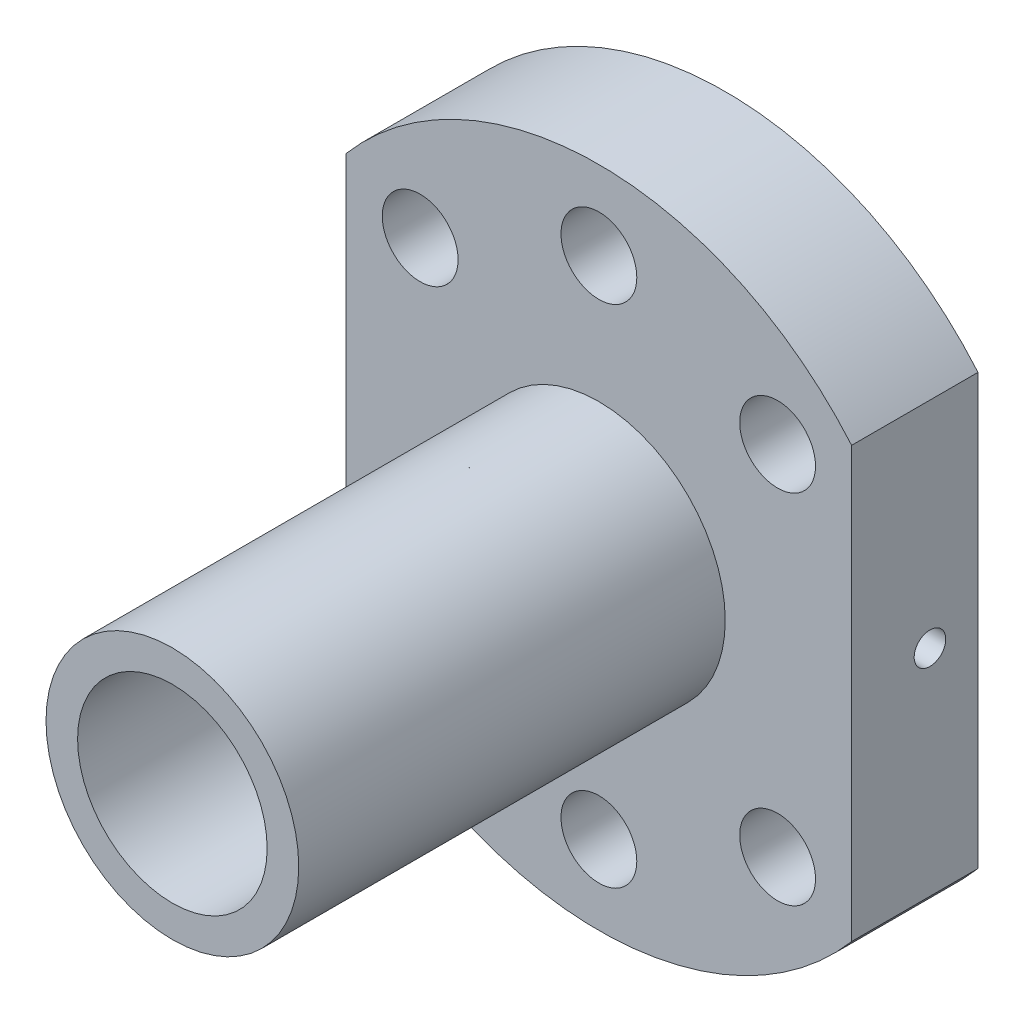
ISO-10303-21;
HEADER;
FILE_DESCRIPTION(('STEP AP214'),'2;1');
FILE_NAME('part.step','',(''),(''),'','','');
FILE_SCHEMA(('AUTOMOTIVE_DESIGN { 1 0 10303 214 1 1 1 1 }'));
ENDSEC;
DATA;
#1=APPLICATION_CONTEXT('core data for automotive mechanical design processes');
#2=APPLICATION_PROTOCOL_DEFINITION('international standard','automotive_design',2000,#1);
#3=PRODUCT_CONTEXT('',#1,'mechanical');
#4=PRODUCT('Part','Part','',(#3));
#5=PRODUCT_RELATED_PRODUCT_CATEGORY('part','',(#4));
#6=PRODUCT_DEFINITION_FORMATION('','',#4);
#7=PRODUCT_DEFINITION_CONTEXT('part definition',#1,'design');
#8=PRODUCT_DEFINITION('design','',#6,#7);
#9=PRODUCT_DEFINITION_SHAPE('','',#8);
#10=(LENGTH_UNIT() NAMED_UNIT(*) SI_UNIT(.MILLI.,.METRE.));
#11=(NAMED_UNIT(*) PLANE_ANGLE_UNIT() SI_UNIT($,.RADIAN.));
#12=(NAMED_UNIT(*) SI_UNIT($,.STERADIAN.) SOLID_ANGLE_UNIT());
#13=UNCERTAINTY_MEASURE_WITH_UNIT(LENGTH_MEASURE(1.E-05),#10,'distance_accuracy_value','');
#14=(GEOMETRIC_REPRESENTATION_CONTEXT(3) GLOBAL_UNCERTAINTY_ASSIGNED_CONTEXT((#13)) GLOBAL_UNIT_ASSIGNED_CONTEXT((#10,
#11,#12)) REPRESENTATION_CONTEXT('',''));
#15=CARTESIAN_POINT('',(0.,0.,0.));
#16=DIRECTION('',(0.,0.,1.));
#17=DIRECTION('',(1.,0.,0.));
#18=AXIS2_PLACEMENT_3D('',#15,#16,#17);
#19=CARTESIAN_POINT('',(0.,0.,35.));
#20=DIRECTION('',(0.,0.,-1.));
#21=DIRECTION('',(-1.,0.,0.));
#22=AXIS2_PLACEMENT_3D('',#19,#20,#21);
#23=CYLINDRICAL_SURFACE('',#22,6.);
#24=CARTESIAN_POINT('',(-6.,0.,4.04085204473662));
#25=CARTESIAN_POINT('',(-5.9999990446753,-0.0557563619832859,4.04084980915749));
#26=CARTESIAN_POINT('',(-5.99921471165214,-0.111543152735528,4.03617313474905));
#27=CARTESIAN_POINT('',(-5.99616137976555,-0.221552088669217,4.01759778123049));
#28=CARTESIAN_POINT('',(-5.99389101569556,-0.275772747183699,4.00369062197198));
#29=CARTESIAN_POINT('',(-5.9881202729458,-0.381041898885057,3.96708586529952));
#30=CARTESIAN_POINT('',(-5.98462090063677,-0.43209294737276,3.94439545848039));
#31=CARTESIAN_POINT('',(-5.97677690832828,-0.529656736791177,3.89088712791566));
#32=CARTESIAN_POINT('',(-5.97243238501774,-0.576169995951435,3.86007013374342));
#33=CARTESIAN_POINT('',(-5.96333326983325,-0.663789045716671,3.79087001120843));
#34=CARTESIAN_POINT('',(-5.95857548725943,-0.704845161413986,3.75242439888217));
#35=CARTESIAN_POINT('',(-5.94921050750693,-0.779955399463969,3.66919285734749));
#36=CARTESIAN_POINT('',(-5.94460331985067,-0.814009079756387,3.62440652815397));
#37=CARTESIAN_POINT('',(-5.93603026303912,-0.874346850242051,3.52942365825779));
#38=CARTESIAN_POINT('',(-5.93206851636655,-0.900581821144398,3.47919551001471));
#39=CARTESIAN_POINT('',(-5.9252791591787,-0.944223346164485,3.37496821901637));
#40=CARTESIAN_POINT('',(-5.92245147205723,-0.961630496626242,3.32096933126556));
#41=CARTESIAN_POINT('',(-5.91828214737102,-0.98696575111392,3.211259934794));
#42=CARTESIAN_POINT('',(-5.9169270739428,-0.994979611654157,3.15556975013606));
#43=CARTESIAN_POINT('',(-5.9158157557466,-1.00156669011595,3.04361993398323));
#44=CARTESIAN_POINT('',(-5.91605939782886,-1.00014057615559,2.9873603430697));
#45=CARTESIAN_POINT('',(-5.91810571545422,-0.987958039358456,2.87648090022644));
#46=CARTESIAN_POINT('',(-5.91989229327567,-0.977297952755904,2.82185012331852));
#47=CARTESIAN_POINT('',(-5.92479798084403,-0.947101256161372,2.71516351760496));
#48=CARTESIAN_POINT('',(-5.92791713629309,-0.927564341727891,2.6631077771812));
#49=CARTESIAN_POINT('',(-5.9351539173364,-0.880070898437559,2.56276051536025));
#50=CARTESIAN_POINT('',(-5.9392762684293,-0.852074365551879,2.51448828230413));
#51=CARTESIAN_POINT('',(-5.94805167366004,-0.788484807022966,2.42329028452126));
#52=CARTESIAN_POINT('',(-5.95270477061714,-0.752891168261708,2.38036495175465));
#53=CARTESIAN_POINT('',(-5.96208811151914,-0.674592884863614,2.30052161041368));
#54=CARTESIAN_POINT('',(-5.96681859692661,-0.631805585549244,2.26368463732059));
#55=CARTESIAN_POINT('',(-5.9757704055869,-0.540614099592651,2.19770093967048));
#56=CARTESIAN_POINT('',(-5.97999172555898,-0.492209876762561,2.16855426466333));
#57=CARTESIAN_POINT('',(-5.98745557157165,-0.391082366466676,2.11877115388211));
#58=CARTESIAN_POINT('',(-5.99069727362979,-0.338355490225857,2.09814187700412));
#59=CARTESIAN_POINT('',(-5.99583001205064,-0.230119338241085,2.06605435863823));
#60=CARTESIAN_POINT('',(-5.9977211614019,-0.174610295671779,2.05459534994713));
#61=CARTESIAN_POINT('',(-5.99992451937075,-0.0630839605206416,2.04128350135217));
#62=CARTESIAN_POINT('',(-6.00025501205114,-0.00708029486039677,2.03931941601438));
#63=CARTESIAN_POINT('',(-5.99934989768468,0.104455909155963,2.04475658250787));
#64=CARTESIAN_POINT('',(-5.99811435089647,0.159988465556823,2.05215747399012));
#65=CARTESIAN_POINT('',(-5.99422730775281,0.268662470218713,2.07602198447081));
#66=CARTESIAN_POINT('',(-5.99158441920524,0.321816347354159,2.09243052809267));
#67=CARTESIAN_POINT('',(-5.98517785782144,0.424618753944184,2.13378585201644));
#68=CARTESIAN_POINT('',(-5.98141412204808,0.474267086363895,2.15873311179073));
#69=CARTESIAN_POINT('',(-5.97313806520963,0.56913227578759,2.21671249461534));
#70=CARTESIAN_POINT('',(-5.96861942354809,0.614306100374866,2.24981410720352));
#71=CARTESIAN_POINT('',(-5.9593538695676,0.698497434201082,2.32306697089065));
#72=CARTESIAN_POINT('',(-5.95460694068619,0.737514495878639,2.36321873404729));
#73=CARTESIAN_POINT('',(-5.94536070094338,0.808697111863207,2.44993106396519));
#74=CARTESIAN_POINT('',(-5.94086446454842,0.840787504445492,2.49655371094239));
#75=CARTESIAN_POINT('',(-5.93268611911154,0.896680924118,2.59459323239204));
#76=CARTESIAN_POINT('',(-5.92900398426408,0.920484213907935,2.64600995482762));
#77=CARTESIAN_POINT('',(-5.92289381479082,0.959015332589265,2.75196793786148));
#78=CARTESIAN_POINT('',(-5.92046061724426,0.973780573019183,2.80649528274882));
#79=CARTESIAN_POINT('',(-5.91711086734104,0.993934181511315,2.91730009642533));
#80=CARTESIAN_POINT('',(-5.91619418313089,0.999323364778471,2.97357741262945));
#81=CARTESIAN_POINT('',(-5.91598693233605,1.00054914641894,3.08553411112159));
#82=CARTESIAN_POINT('',(-5.9166762260226,0.996504054450078,3.14121219616674));
#83=CARTESIAN_POINT('',(-5.91955912581491,0.979231935582742,3.25108374395693));
#84=CARTESIAN_POINT('',(-5.92175272704486,0.966004938444993,3.30527721151337));
#85=CARTESIAN_POINT('',(-5.92738942512688,0.930789795837963,3.41059541965367));
#86=CARTESIAN_POINT('',(-5.93083106887868,0.908811836240179,3.46172364875903));
#87=CARTESIAN_POINT('',(-5.93857747568883,0.856730801566365,3.55958631241456));
#88=CARTESIAN_POINT('',(-5.9428822815536,0.826627323499427,3.60632052888548));
#89=CARTESIAN_POINT('',(-5.95193381618249,0.758727553748863,3.69466627797973));
#90=CARTESIAN_POINT('',(-5.95668518230521,0.72084422543746,3.73621045141673));
#91=CARTESIAN_POINT('',(-5.96605748944336,0.638643612552093,3.8123926865266));
#92=CARTESIAN_POINT('',(-5.97067840010619,0.594324845165055,3.84702915219189));
#93=CARTESIAN_POINT('',(-5.97930611856888,0.500147667856113,3.9086313520166));
#94=CARTESIAN_POINT('',(-5.98330846501242,0.450253115013128,3.9355424604618));
#95=CARTESIAN_POINT('',(-5.9902046704071,0.346605227751592,3.98055983858059));
#96=CARTESIAN_POINT('',(-5.99309963270993,0.292855797932004,3.9986748771685));
#97=CARTESIAN_POINT('',(-5.99682316333182,0.19908132401816,4.02165415438729));
#98=CARTESIAN_POINT('',(-5.99800810909344,0.159623532119379,4.02884183258301));
#99=CARTESIAN_POINT('',(-5.99959686394448,0.0801157241279235,4.03844153987452));
#100=CARTESIAN_POINT('',(-6.00000068648257,0.0400657182433976,4.04085365119157));
#101=CARTESIAN_POINT('',(-6.,0.,4.04085204473662));
#102=B_SPLINE_CURVE_WITH_KNOTS('',3,(#24,#25,#26,#27,#28,#29,#30,#31,#32,#33,#34,#35,#36,#37,
#38,#39,#40,#41,#42,#43,#44,#45,#46,#47,#48,#49,#50,#51,#52,#53,#54,#55,#56,#57,#58,#59,#60,#61,
#62,#63,#64,#65,#66,#67,#68,#69,#70,#71,#72,#73,#74,#75,#76,#77,#78,#79,#80,#81,#82,#83,#84,#85,
#86,#87,#88,#89,#90,#91,#92,#93,#94,#95,#96,#97,#98,#99,#100,#101),.UNSPECIFIED.,.T.,.F.,(4,2,2,
2,2,2,2,2,2,2,2,2,2,2,2,2,2,2,2,2,2,2,2,2,2,2,2,2,2,2,2,2,2,2,2,2,2,2,4),(0.,0.167122633975404,
0.334399018278168,0.501538746810108,0.668659365069916,0.837209964249328,1.00577120067943,
1.17537008329536,1.34495750750472,1.51298430841369,1.68099921728355,1.84728208704163,
2.01357066010152,2.18065822653023,2.34775928272229,2.51693107964531,2.68610396654339,
2.85541875566361,3.02471937808459,3.19203153396559,3.35933725214344,3.52563122802566,
3.69193454330426,3.85970730250809,4.02749225221713,4.19701528803048,4.36653294950377,
4.53534408936709,4.70414055114647,4.8708316380908,5.03752218475253,5.20401927290489,
5.37052462011734,5.53900553677357,5.70752533551589,5.8772089264288,6.04672300852029,
6.16681699265607,6.28690890910787),.UNSPECIFIED.);
#103=CARTESIAN_POINT('',(-6.,0.,4.04085204473662));
#104=VERTEX_POINT('',#103);
#105=EDGE_CURVE('E164',#104,#104,#102,.T.);
#106=ORIENTED_EDGE('',*,*,#105,.F.);
#107=EDGE_LOOP('',(#106));
#108=FACE_BOUND('',#107,.T.);
#109=CARTESIAN_POINT('',(5.91607978309962,-0.999999999999994,3.04085204473662));
#110=CARTESIAN_POINT('',(5.91608078960511,-0.999997759368396,3.09660234399503));
#111=CARTESIAN_POINT('',(5.91687637019227,-0.995322067614922,3.15238308714657));
#112=CARTESIAN_POINT('',(5.91996982947272,-0.976750971230151,3.26237946202469));
#113=CARTESIAN_POINT('',(5.92226909356571,-0.962847064123854,3.31659360223643));
#114=CARTESIAN_POINT('',(5.9281024372893,-0.92625181746685,3.42184895807933));
#115=CARTESIAN_POINT('',(5.9316354846878,-0.903567821972428,3.47289278420314));
#116=CARTESIAN_POINT('',(5.93953708845736,-0.85007459875614,3.5704444266221));
#117=CARTESIAN_POINT('',(5.94390555078989,-0.819266285400621,3.61695275256712));
#118=CARTESIAN_POINT('',(5.95303388461044,-0.750075010786514,3.70457718463489));
#119=CARTESIAN_POINT('',(5.95779686930828,-0.711627619572903,3.74564209729122));
#120=CARTESIAN_POINT('',(5.96714992267783,-0.62838880187813,3.82076936748123));
#121=CARTESIAN_POINT('',(5.97173998108788,-0.583596999659989,3.85483130998276));
#122=CARTESIAN_POINT('',(5.98026294792988,-0.488609147979329,3.91517787162436));
#123=CARTESIAN_POINT('',(5.98419176972911,-0.438382432582675,3.94141484782935));
#124=CARTESIAN_POINT('',(5.99091494782862,-0.334158248689543,3.98506047294883));
#125=CARTESIAN_POINT('',(5.9937093778907,-0.280161025631269,4.00246969589057));
#126=CARTESIAN_POINT('',(5.99782693889752,-0.17045749053769,4.02780905873018));
#127=CARTESIAN_POINT('',(5.99916341244362,-0.114771554671702,4.0358252111385));
#128=CARTESIAN_POINT('',(6.00026031737113,-0.00283011421031306,4.04241834639766));
#129=CARTESIAN_POINT('',(6.00002085587723,0.0534253514115653,4.04099597083551));
#130=CARTESIAN_POINT('',(5.99800343372556,0.164320874031556,4.02881950412534));
#131=CARTESIAN_POINT('',(5.99624073476959,0.218971412280062,4.01815797937296));
#132=CARTESIAN_POINT('',(5.99139191508655,0.325696791844722,3.98795161503802));
#133=CARTESIAN_POINT('',(5.98830575405285,0.377771554660607,3.96840650490082));
#134=CARTESIAN_POINT('',(5.98113079404783,0.478142459113065,3.92089578861049));
#135=CARTESIAN_POINT('',(5.97703746930752,0.526420209207624,3.89289203990365));
#136=CARTESIAN_POINT('',(5.96830295228599,0.617626211938662,3.8292869156826));
#137=CARTESIAN_POINT('',(5.96366171567654,0.660554031166356,3.79368492525229));
#138=CARTESIAN_POINT('',(5.95428107293039,0.740388509378672,3.7153805220889));
#139=CARTESIAN_POINT('',(5.94954115892417,0.777215800901289,3.67259720677623));
#140=CARTESIAN_POINT('',(5.94055183913922,0.843181835379232,3.58141720865029));
#141=CARTESIAN_POINT('',(5.9363024378853,0.872320507412973,3.53302047406349));
#142=CARTESIAN_POINT('',(5.92877501824727,0.92209777379532,3.43189538798563));
#143=CARTESIAN_POINT('',(5.9254980932104,0.942726810911703,3.37916224549979));
#144=CARTESIAN_POINT('',(5.92030475475952,0.974811948326253,3.2709124158136));
#145=CARTESIAN_POINT('',(5.91838822155328,0.986268856307188,3.21539597416365));
#146=CARTESIAN_POINT('',(5.91615583768846,0.999572753951713,3.10386558227177));
#147=CARTESIAN_POINT('',(5.91582114303468,1.00153288316498,3.04786549285578));
#148=CARTESIAN_POINT('',(5.91674013912944,0.996089081072989,2.93633737606029));
#149=CARTESIAN_POINT('',(5.91799376852741,0.988685511449872,2.88080933053103));
#150=CARTESIAN_POINT('',(5.92193074982007,0.964820933971245,2.77216094106028));
#151=CARTESIAN_POINT('',(5.92460500767339,0.948417516258561,2.71902758878542));
#152=CARTESIAN_POINT('',(5.93107429202201,0.907079276076917,2.61626397822483));
#153=CARTESIAN_POINT('',(5.93486938556232,0.882143943240381,2.56663392971626));
#154=CARTESIAN_POINT('',(5.94319651358957,0.824182669291697,2.47178220697418));
#155=CARTESIAN_POINT('',(5.94773502240139,0.791084225663752,2.4266054156342));
#156=CARTESIAN_POINT('',(5.95701866671947,0.717835786283199,2.34240663165862));
#157=CARTESIAN_POINT('',(5.96176381674132,0.677685294553624,2.30338507229273));
#158=CARTESIAN_POINT('',(5.97098568847306,0.59097122813153,2.23219128764514));
#159=CARTESIAN_POINT('',(5.97545910537869,0.544345301354485,2.2000945142228));
#160=CARTESIAN_POINT('',(5.98358044973177,0.446297379179737,2.14418991393467));
#161=CARTESIAN_POINT('',(5.9872284038799,0.394875538988258,2.12038181894708));
#162=CARTESIAN_POINT('',(5.99327343267833,0.288919620600538,2.08184781115468));
#163=CARTESIAN_POINT('',(5.99567593827049,0.234400225041051,2.06708241444265));
#164=CARTESIAN_POINT('',(5.99898233267713,0.123612293949692,2.04692580515109));
#165=CARTESIAN_POINT('',(5.99988634480071,0.0673439027286564,2.04153382124368));
#166=CARTESIAN_POINT('',(6.0000921515513,-0.0446165103094656,2.04029929181174));
#167=CARTESIAN_POINT('',(5.99941320809696,-0.100307264241065,2.0443419431602));
#168=CARTESIAN_POINT('',(5.99656871354913,-0.21020478972587,2.06161361364438));
#169=CARTESIAN_POINT('',(5.99440317078001,-0.264411569586963,2.07484258134045));
#170=CARTESIAN_POINT('',(5.98882795531034,-0.36975857836743,2.11006731095412));
#171=CARTESIAN_POINT('',(5.98541966816622,-0.420902148861602,2.1320533120208));
#172=CARTESIAN_POINT('',(5.97773102750941,-0.518792181192779,2.18415521922869));
#173=CARTESIAN_POINT('',(5.97345063265953,-0.565538434446979,2.21427151076101));
#174=CARTESIAN_POINT('',(5.96443051847589,-0.653885178210857,2.28218608172142));
#175=CARTESIAN_POINT('',(5.95968609820294,-0.695420572242239,2.32006842663937));
#176=CARTESIAN_POINT('',(5.95030521321901,-0.77158555037921,2.4022633678959));
#177=CARTESIAN_POINT('',(5.94566877405441,-0.806213514680469,2.44657746829324));
#178=CARTESIAN_POINT('',(5.93699337428039,-0.867805708367838,2.54075017373968));
#179=CARTESIAN_POINT('',(5.93295887192494,-0.894713995637809,2.59064578067184));
#180=CARTESIAN_POINT('',(5.92599684088708,-0.939725814576358,2.69429573910119));
#181=CARTESIAN_POINT('',(5.92306820700509,-0.957838142092634,2.74804617381538));
#182=CARTESIAN_POINT('',(5.91929897935112,-0.980810421248851,2.84181355252729));
#183=CARTESIAN_POINT('',(5.91809849368407,-0.987994967068105,2.88126276792));
#184=CARTESIAN_POINT('',(5.91648854114608,-0.997590518072962,2.96075343867306));
#185=CARTESIAN_POINT('',(5.91607905991511,-1.00000160991676,3.00079488326869));
#186=CARTESIAN_POINT('',(5.91607978309962,-0.999999999999994,3.04085204473662));
#187=B_SPLINE_CURVE_WITH_KNOTS('',3,(#109,#110,#111,#112,#113,#114,#115,#116,#117,#118,#119,
#120,#121,#122,#123,#124,#125,#126,#127,#128,#129,#130,#131,#132,#133,#134,#135,#136,#137,#138,
#139,#140,#141,#142,#143,#144,#145,#146,#147,#148,#149,#150,#151,#152,#153,#154,#155,#156,#157,
#158,#159,#160,#161,#162,#163,#164,#165,#166,#167,#168,#169,#170,#171,#172,#173,#174,#175,#176,
#177,#178,#179,#180,#181,#182,#183,#184,#185,#186),.UNSPECIFIED.,.T.,.F.,(4,2,2,2,2,2,2,2,2,2,2,
2,2,2,2,2,2,2,2,2,2,2,2,2,2,2,2,2,2,2,2,2,2,2,2,2,2,2,4),(0.,0.167104415562128,
0.334363007967779,0.501481999132666,0.668582189603686,0.837156636605449,1.00574107132038,
1.17533192042833,1.34491174042704,1.51292626987285,1.68092937859336,1.84726848464126,
2.01361265698072,2.18071841654029,2.34783770488965,2.51698449383108,2.68613284296667,
2.855470649977,3.0247935437349,3.19209416966423,3.35938833363849,3.52562425852456,
3.69187012915689,3.8596493710334,4.02744041770535,4.19697645212412,4.36650700188938,
4.53529193765317,4.70406298363199,4.87079110504626,5.03751829285788,5.20406015931242,
5.37060992155193,5.5390679898356,5.70756551550984,5.8772549104514,6.04677426695051,
6.16684268214775,6.28690891757997),.UNSPECIFIED.);
#188=CARTESIAN_POINT('',(5.91607978309962,-0.999999999999994,3.04085204473662));
#189=VERTEX_POINT('',#188);
#190=EDGE_CURVE('E173',#189,#189,#187,.T.);
#191=ORIENTED_EDGE('',*,*,#190,.F.);
#192=EDGE_LOOP('',(#191));
#193=FACE_BOUND('',#192,.T.);
#194=CARTESIAN_POINT('',(0.,0.,35.));
#195=DIRECTION('',(0.,0.,1.));
#196=DIRECTION('',(1.,0.,0.));
#197=AXIS2_PLACEMENT_3D('',#194,#195,#196);
#198=CIRCLE('',#197,6.);
#199=CARTESIAN_POINT('',(6.,0.,35.));
#200=VERTEX_POINT('',#199);
#201=EDGE_CURVE('E119',#200,#200,#198,.T.);
#202=ORIENTED_EDGE('',*,*,#201,.T.);
#203=EDGE_LOOP('',(#202));
#204=FACE_BOUND('',#203,.T.);
#205=CARTESIAN_POINT('',(0.,0.,1.5));
#206=DIRECTION('',(0.,0.,-1.));
#207=DIRECTION('',(-1.,0.,0.));
#208=AXIS2_PLACEMENT_3D('',#205,#206,#207);
#209=CIRCLE('',#208,6.);
#210=CARTESIAN_POINT('',(-6.,0.,1.5));
#211=VERTEX_POINT('',#210);
#212=EDGE_CURVE('E39',#211,#211,#209,.T.);
#213=ORIENTED_EDGE('',*,*,#212,.T.);
#214=EDGE_LOOP('',(#213));
#215=FACE_BOUND('',#214,.T.);
#216=ADVANCED_FACE('F35',(#108,#193,#204,#215),#23,.F.);
#217=CARTESIAN_POINT('',(0.,0.,8.));
#218=DIRECTION('',(0.,0.,1.));
#219=DIRECTION('',(1.,0.,0.));
#220=AXIS2_PLACEMENT_3D('',#217,#218,#219);
#221=PLANE('',#220);
#222=CARTESIAN_POINT('',(-11.3137084989846,11.3137084989849,8.));
#223=DIRECTION('',(0.,0.,1.));
#224=DIRECTION('',(1.,0.,0.));
#225=AXIS2_PLACEMENT_3D('',#222,#223,#224);
#226=CIRCLE('',#225,2.40000000000531);
#227=CARTESIAN_POINT('',(-8.91370849897931,11.3137084989849,8.));
#228=VERTEX_POINT('',#227);
#229=EDGE_CURVE('E155',#228,#228,#226,.T.);
#230=ORIENTED_EDGE('',*,*,#229,.F.);
#231=EDGE_LOOP('',(#230));
#232=FACE_BOUND('',#231,.T.);
#233=CARTESIAN_POINT('',(-11.3137084989849,-11.3137084989847,8.));
#234=DIRECTION('',(0.,0.,1.));
#235=DIRECTION('',(1.,0.,0.));
#236=AXIS2_PLACEMENT_3D('',#233,#234,#235);
#237=CIRCLE('',#236,2.40000000000531);
#238=CARTESIAN_POINT('',(-8.91370849897955,-11.3137084989847,8.));
#239=VERTEX_POINT('',#238);
#240=EDGE_CURVE('E149',#239,#239,#237,.T.);
#241=ORIENTED_EDGE('',*,*,#240,.F.);
#242=EDGE_LOOP('',(#241));
#243=FACE_BOUND('',#242,.T.);
#244=CARTESIAN_POINT('',(-1.1172740284298E-13,-16.,8.));
#245=DIRECTION('',(0.,0.,1.));
#246=DIRECTION('',(1.,0.,0.));
#247=AXIS2_PLACEMENT_3D('',#244,#245,#246);
#248=CIRCLE('',#247,2.40000000000531);
#249=CARTESIAN_POINT('',(2.4000000000052,-16.,8.));
#250=VERTEX_POINT('',#249);
#251=EDGE_CURVE('E143',#250,#250,#248,.T.);
#252=ORIENTED_EDGE('',*,*,#251,.F.);
#253=EDGE_LOOP('',(#252));
#254=FACE_BOUND('',#253,.T.);
#255=CARTESIAN_POINT('',(11.3137084989847,-11.3137084989848,8.));
#256=DIRECTION('',(0.,0.,1.));
#257=DIRECTION('',(1.,0.,0.));
#258=AXIS2_PLACEMENT_3D('',#255,#256,#257);
#259=CIRCLE('',#258,2.40000000000531);
#260=CARTESIAN_POINT('',(13.71370849899,-11.3137084989848,8.));
#261=VERTEX_POINT('',#260);
#262=EDGE_CURVE('E137',#261,#261,#259,.T.);
#263=ORIENTED_EDGE('',*,*,#262,.F.);
#264=EDGE_LOOP('',(#263));
#265=FACE_BOUND('',#264,.T.);
#266=CARTESIAN_POINT('',(11.3137084989848,11.3137084989847,8.));
#267=DIRECTION('',(0.,0.,1.));
#268=DIRECTION('',(1.,0.,0.));
#269=AXIS2_PLACEMENT_3D('',#266,#267,#268);
#270=CIRCLE('',#269,2.40000000000531);
#271=CARTESIAN_POINT('',(13.7137084989901,11.3137084989847,8.));
#272=VERTEX_POINT('',#271);
#273=EDGE_CURVE('E131',#272,#272,#270,.T.);
#274=ORIENTED_EDGE('',*,*,#273,.F.);
#275=EDGE_LOOP('',(#274));
#276=FACE_BOUND('',#275,.T.);
#277=CARTESIAN_POINT('',(0.,16.,8.));
#278=DIRECTION('',(0.,0.,1.));
#279=DIRECTION('',(1.,0.,0.));
#280=AXIS2_PLACEMENT_3D('',#277,#278,#279);
#281=CIRCLE('',#280,2.40000000000531);
#282=CARTESIAN_POINT('',(2.40000000000531,16.,8.));
#283=VERTEX_POINT('',#282);
#284=EDGE_CURVE('E125',#283,#283,#281,.T.);
#285=ORIENTED_EDGE('',*,*,#284,.F.);
#286=EDGE_LOOP('',(#285));
#287=FACE_BOUND('',#286,.T.);
#288=CARTESIAN_POINT('',(0.,0.,8.));
#289=DIRECTION('',(0.,0.,1.));
#290=DIRECTION('',(1.,0.,0.));
#291=AXIS2_PLACEMENT_3D('',#288,#289,#290);
#292=CIRCLE('',#291,21.);
#293=CARTESIAN_POINT('',(16.,13.6014705087354,8.));
#294=VERTEX_POINT('',#293);
#295=CARTESIAN_POINT('',(-16.,13.6014705087354,8.));
#296=VERTEX_POINT('',#295);
#297=EDGE_CURVE('E89',#294,#296,#292,.T.);
#298=ORIENTED_EDGE('',*,*,#297,.T.);
#299=DIRECTION('',(0.,-1.,0.));
#300=VECTOR('',#299,1.);
#301=CARTESIAN_POINT('',(-16.,13.6014705087354,8.));
#302=LINE('',#301,#300);
#303=CARTESIAN_POINT('',(-16.,-13.6014705087354,8.));
#304=VERTEX_POINT('',#303);
#305=EDGE_CURVE('E83',#296,#304,#302,.T.);
#306=ORIENTED_EDGE('',*,*,#305,.T.);
#307=CARTESIAN_POINT('',(0.,0.,8.));
#308=DIRECTION('',(0.,0.,1.));
#309=DIRECTION('',(1.,0.,0.));
#310=AXIS2_PLACEMENT_3D('',#307,#308,#309);
#311=CIRCLE('',#310,21.);
#312=CARTESIAN_POINT('',(16.,-13.6014705087354,8.));
#313=VERTEX_POINT('',#312);
#314=EDGE_CURVE('E87',#304,#313,#311,.T.);
#315=ORIENTED_EDGE('',*,*,#314,.T.);
#316=DIRECTION('',(0.,1.,0.));
#317=VECTOR('',#316,1.);
#318=CARTESIAN_POINT('',(16.,-13.6014705087354,8.));
#319=LINE('',#318,#317);
#320=EDGE_CURVE('E53',#313,#294,#319,.T.);
#321=ORIENTED_EDGE('',*,*,#320,.T.);
#322=EDGE_LOOP('',(#298,#306,#315,#321));
#323=FACE_BOUND('',#322,.T.);
#324=CARTESIAN_POINT('',(0.,0.,8.));
#325=DIRECTION('',(0.,0.,1.));
#326=DIRECTION('',(1.,0.,0.));
#327=AXIS2_PLACEMENT_3D('',#324,#325,#326);
#328=CIRCLE('',#327,8.);
#329=CARTESIAN_POINT('',(8.,0.,8.));
#330=VERTEX_POINT('',#329);
#331=EDGE_CURVE('E116',#330,#330,#328,.T.);
#332=ORIENTED_EDGE('',*,*,#331,.F.);
#333=EDGE_LOOP('',(#332));
#334=FACE_BOUND('',#333,.T.);
#335=ADVANCED_FACE('F84',(#232,#243,#254,#265,#276,#287,#323,#334),#221,.T.);
#336=CARTESIAN_POINT('',(0.,0.,8.));
#337=DIRECTION('',(0.,0.,-1.));
#338=DIRECTION('',(-1.,0.,0.));
#339=AXIS2_PLACEMENT_3D('',#336,#337,#338);
#340=CYLINDRICAL_SURFACE('',#339,21.);
#341=CARTESIAN_POINT('',(0.,0.,0.));
#342=DIRECTION('',(0.,0.,1.));
#343=DIRECTION('',(1.,0.,0.));
#344=AXIS2_PLACEMENT_3D('',#341,#342,#343);
#345=CIRCLE('',#344,21.);
#346=CARTESIAN_POINT('',(16.,13.6014705087354,0.));
#347=VERTEX_POINT('',#346);
#348=CARTESIAN_POINT('',(-16.,13.6014705087354,0.));
#349=VERTEX_POINT('',#348);
#350=EDGE_CURVE('E102',#347,#349,#345,.T.);
#351=ORIENTED_EDGE('',*,*,#350,.T.);
#352=DIRECTION('',(0.,0.,-1.));
#353=VECTOR('',#352,1.);
#354=CARTESIAN_POINT('',(-16.,13.6014705087354,8.));
#355=LINE('',#354,#353);
#356=EDGE_CURVE('E11',#296,#349,#355,.T.);
#357=ORIENTED_EDGE('',*,*,#356,.F.);
#358=ORIENTED_EDGE('',*,*,#297,.F.);
#359=DIRECTION('',(0.,0.,-1.));
#360=VECTOR('',#359,1.);
#361=CARTESIAN_POINT('',(16.,13.6014705087354,8.));
#362=LINE('',#361,#360);
#363=EDGE_CURVE('E98',#294,#347,#362,.T.);
#364=ORIENTED_EDGE('',*,*,#363,.T.);
#365=EDGE_LOOP('',(#351,#357,#358,#364));
#366=FACE_BOUND('',#365,.T.);
#367=ADVANCED_FACE('F37',(#366),#340,.T.);
#368=CARTESIAN_POINT('',(-16.,13.6014705087354,8.));
#369=DIRECTION('',(1.,0.,0.));
#370=DIRECTION('',(0.,1.,0.));
#371=AXIS2_PLACEMENT_3D('',#368,#369,#370);
#372=PLANE('',#371);
#373=CARTESIAN_POINT('',(-16.,0.,3.04085204473662));
#374=DIRECTION('',(-1.,0.,0.));
#375=DIRECTION('',(0.,-1.,0.));
#376=AXIS2_PLACEMENT_3D('',#373,#374,#375);
#377=CIRCLE('',#376,1.);
#378=CARTESIAN_POINT('',(-16.,-0.999999999999998,3.04085204473662));
#379=VERTEX_POINT('',#378);
#380=EDGE_CURVE('E292',#379,#379,#377,.T.);
#381=ORIENTED_EDGE('',*,*,#380,.F.);
#382=EDGE_LOOP('',(#381));
#383=FACE_BOUND('',#382,.T.);
#384=DIRECTION('',(0.,-1.,0.));
#385=VECTOR('',#384,1.);
#386=CARTESIAN_POINT('',(-16.,13.6014705087354,0.));
#387=LINE('',#386,#385);
#388=CARTESIAN_POINT('',(-16.,-13.6014705087354,0.));
#389=VERTEX_POINT('',#388);
#390=EDGE_CURVE('E93',#349,#389,#387,.T.);
#391=ORIENTED_EDGE('',*,*,#390,.T.);
#392=DIRECTION('',(0.,0.,-1.));
#393=VECTOR('',#392,1.);
#394=CARTESIAN_POINT('',(-16.,-13.6014705087354,8.));
#395=LINE('',#394,#393);
#396=EDGE_CURVE('E45',#304,#389,#395,.T.);
#397=ORIENTED_EDGE('',*,*,#396,.F.);
#398=ORIENTED_EDGE('',*,*,#305,.F.);
#399=ORIENTED_EDGE('',*,*,#356,.T.);
#400=EDGE_LOOP('',(#391,#397,#398,#399));
#401=FACE_BOUND('',#400,.T.);
#402=ADVANCED_FACE('F92',(#383,#401),#372,.F.);
#403=CARTESIAN_POINT('',(0.,0.,8.));
#404=DIRECTION('',(0.,0.,-1.));
#405=DIRECTION('',(-1.,0.,0.));
#406=AXIS2_PLACEMENT_3D('',#403,#404,#405);
#407=CYLINDRICAL_SURFACE('',#406,21.);
#408=CARTESIAN_POINT('',(0.,0.,0.));
#409=DIRECTION('',(0.,0.,1.));
#410=DIRECTION('',(1.,0.,0.));
#411=AXIS2_PLACEMENT_3D('',#408,#409,#410);
#412=CIRCLE('',#411,21.);
#413=CARTESIAN_POINT('',(16.,-13.6014705087354,0.));
#414=VERTEX_POINT('',#413);
#415=EDGE_CURVE('E70',#389,#414,#412,.T.);
#416=ORIENTED_EDGE('',*,*,#415,.T.);
#417=DIRECTION('',(0.,0.,-1.));
#418=VECTOR('',#417,1.);
#419=CARTESIAN_POINT('',(16.,-13.6014705087354,8.));
#420=LINE('',#419,#418);
#421=EDGE_CURVE('E94',#313,#414,#420,.T.);
#422=ORIENTED_EDGE('',*,*,#421,.F.);
#423=ORIENTED_EDGE('',*,*,#314,.F.);
#424=ORIENTED_EDGE('',*,*,#396,.T.);
#425=EDGE_LOOP('',(#416,#422,#423,#424));
#426=FACE_BOUND('',#425,.T.);
#427=ADVANCED_FACE('F96',(#426),#407,.T.);
#428=CARTESIAN_POINT('',(16.,-13.6014705087354,8.));
#429=DIRECTION('',(-1.,0.,0.));
#430=DIRECTION('',(0.,0.,1.));
#431=AXIS2_PLACEMENT_3D('',#428,#429,#430);
#432=PLANE('',#431);
#433=CARTESIAN_POINT('',(16.,0.,3.04085204473662));
#434=DIRECTION('',(-1.,0.,0.));
#435=DIRECTION('',(0.,-1.,0.));
#436=AXIS2_PLACEMENT_3D('',#433,#434,#435);
#437=CIRCLE('',#436,1.);
#438=CARTESIAN_POINT('',(16.,-0.999999999999992,3.04085204473662));
#439=VERTEX_POINT('',#438);
#440=EDGE_CURVE('E294',#439,#439,#437,.T.);
#441=ORIENTED_EDGE('',*,*,#440,.T.);
#442=EDGE_LOOP('',(#441));
#443=FACE_BOUND('',#442,.T.);
#444=DIRECTION('',(0.,1.,0.));
#445=VECTOR('',#444,1.);
#446=CARTESIAN_POINT('',(16.,-13.6014705087354,0.));
#447=LINE('',#446,#445);
#448=EDGE_CURVE('E76',#414,#347,#447,.T.);
#449=ORIENTED_EDGE('',*,*,#448,.T.);
#450=ORIENTED_EDGE('',*,*,#363,.F.);
#451=ORIENTED_EDGE('',*,*,#320,.F.);
#452=ORIENTED_EDGE('',*,*,#421,.T.);
#453=EDGE_LOOP('',(#449,#450,#451,#452));
#454=FACE_BOUND('',#453,.T.);
#455=ADVANCED_FACE('F110',(#443,#454),#432,.F.);
#456=CARTESIAN_POINT('',(0.,0.,0.));
#457=DIRECTION('',(0.,0.,1.));
#458=DIRECTION('',(1.,0.,0.));
#459=AXIS2_PLACEMENT_3D('',#456,#457,#458);
#460=PLANE('',#459);
#461=CARTESIAN_POINT('',(0.,0.,0.));
#462=DIRECTION('',(0.,0.,-1.));
#463=DIRECTION('',(-1.,0.,0.));
#464=AXIS2_PLACEMENT_3D('',#461,#462,#463);
#465=CIRCLE('',#464,9.);
#466=CARTESIAN_POINT('',(-9.,0.,0.));
#467=VERTEX_POINT('',#466);
#468=EDGE_CURVE('E160',#467,#467,#465,.T.);
#469=ORIENTED_EDGE('',*,*,#468,.F.);
#470=EDGE_LOOP('',(#469));
#471=FACE_BOUND('',#470,.T.);
#472=CARTESIAN_POINT('',(-11.3137084989846,11.3137084989849,0.));
#473=DIRECTION('',(0.,0.,1.));
#474=DIRECTION('',(1.,0.,0.));
#475=AXIS2_PLACEMENT_3D('',#472,#473,#474);
#476=CIRCLE('',#475,2.40000000000531);
#477=CARTESIAN_POINT('',(-8.91370849897931,11.3137084989849,0.));
#478=VERTEX_POINT('',#477);
#479=EDGE_CURVE('E152',#478,#478,#476,.T.);
#480=ORIENTED_EDGE('',*,*,#479,.T.);
#481=EDGE_LOOP('',(#480));
#482=FACE_BOUND('',#481,.T.);
#483=CARTESIAN_POINT('',(-11.3137084989849,-11.3137084989847,0.));
#484=DIRECTION('',(0.,0.,1.));
#485=DIRECTION('',(1.,0.,0.));
#486=AXIS2_PLACEMENT_3D('',#483,#484,#485);
#487=CIRCLE('',#486,2.40000000000531);
#488=CARTESIAN_POINT('',(-8.91370849897955,-11.3137084989847,0.));
#489=VERTEX_POINT('',#488);
#490=EDGE_CURVE('E146',#489,#489,#487,.T.);
#491=ORIENTED_EDGE('',*,*,#490,.T.);
#492=EDGE_LOOP('',(#491));
#493=FACE_BOUND('',#492,.T.);
#494=CARTESIAN_POINT('',(-1.1172740284298E-13,-16.,0.));
#495=DIRECTION('',(0.,0.,1.));
#496=DIRECTION('',(1.,0.,0.));
#497=AXIS2_PLACEMENT_3D('',#494,#495,#496);
#498=CIRCLE('',#497,2.40000000000531);
#499=CARTESIAN_POINT('',(2.4000000000052,-16.,0.));
#500=VERTEX_POINT('',#499);
#501=EDGE_CURVE('E140',#500,#500,#498,.T.);
#502=ORIENTED_EDGE('',*,*,#501,.T.);
#503=EDGE_LOOP('',(#502));
#504=FACE_BOUND('',#503,.T.);
#505=CARTESIAN_POINT('',(11.3137084989847,-11.3137084989848,0.));
#506=DIRECTION('',(0.,0.,1.));
#507=DIRECTION('',(1.,0.,0.));
#508=AXIS2_PLACEMENT_3D('',#505,#506,#507);
#509=CIRCLE('',#508,2.40000000000531);
#510=CARTESIAN_POINT('',(13.71370849899,-11.3137084989848,0.));
#511=VERTEX_POINT('',#510);
#512=EDGE_CURVE('E134',#511,#511,#509,.T.);
#513=ORIENTED_EDGE('',*,*,#512,.T.);
#514=EDGE_LOOP('',(#513));
#515=FACE_BOUND('',#514,.T.);
#516=CARTESIAN_POINT('',(11.3137084989848,11.3137084989847,0.));
#517=DIRECTION('',(0.,0.,1.));
#518=DIRECTION('',(1.,0.,0.));
#519=AXIS2_PLACEMENT_3D('',#516,#517,#518);
#520=CIRCLE('',#519,2.40000000000531);
#521=CARTESIAN_POINT('',(13.7137084989901,11.3137084989847,0.));
#522=VERTEX_POINT('',#521);
#523=EDGE_CURVE('E128',#522,#522,#520,.T.);
#524=ORIENTED_EDGE('',*,*,#523,.T.);
#525=EDGE_LOOP('',(#524));
#526=FACE_BOUND('',#525,.T.);
#527=CARTESIAN_POINT('',(0.,16.,0.));
#528=DIRECTION('',(0.,0.,1.));
#529=DIRECTION('',(1.,0.,0.));
#530=AXIS2_PLACEMENT_3D('',#527,#528,#529);
#531=CIRCLE('',#530,2.40000000000531);
#532=CARTESIAN_POINT('',(2.40000000000531,16.,0.));
#533=VERTEX_POINT('',#532);
#534=EDGE_CURVE('E124',#533,#533,#531,.T.);
#535=ORIENTED_EDGE('',*,*,#534,.T.);
#536=EDGE_LOOP('',(#535));
#537=FACE_BOUND('',#536,.T.);
#538=ORIENTED_EDGE('',*,*,#350,.F.);
#539=ORIENTED_EDGE('',*,*,#448,.F.);
#540=ORIENTED_EDGE('',*,*,#415,.F.);
#541=ORIENTED_EDGE('',*,*,#390,.F.);
#542=EDGE_LOOP('',(#538,#539,#540,#541));
#543=FACE_BOUND('',#542,.T.);
#544=ADVANCED_FACE('F113',(#471,#482,#493,#504,#515,#526,#537,#543),#460,.F.);
#545=CARTESIAN_POINT('',(0.,0.,35.));
#546=DIRECTION('',(0.,0.,1.));
#547=DIRECTION('',(1.,0.,0.));
#548=AXIS2_PLACEMENT_3D('',#545,#546,#547);
#549=PLANE('',#548);
#550=CARTESIAN_POINT('',(0.,0.,35.));
#551=DIRECTION('',(0.,0.,1.));
#552=DIRECTION('',(1.,0.,0.));
#553=AXIS2_PLACEMENT_3D('',#550,#551,#552);
#554=CIRCLE('',#553,8.);
#555=CARTESIAN_POINT('',(8.,0.,35.));
#556=VERTEX_POINT('',#555);
#557=EDGE_CURVE('E105',#556,#556,#554,.T.);
#558=ORIENTED_EDGE('',*,*,#557,.T.);
#559=EDGE_LOOP('',(#558));
#560=FACE_BOUND('',#559,.T.);
#561=ORIENTED_EDGE('',*,*,#201,.F.);
#562=EDGE_LOOP('',(#561));
#563=FACE_BOUND('',#562,.T.);
#564=ADVANCED_FACE('F221',(#560,#563),#549,.T.);
#565=CARTESIAN_POINT('',(0.,0.,35.));
#566=DIRECTION('',(0.,0.,-1.));
#567=DIRECTION('',(-1.,0.,0.));
#568=AXIS2_PLACEMENT_3D('',#565,#566,#567);
#569=CYLINDRICAL_SURFACE('',#568,8.);
#570=ORIENTED_EDGE('',*,*,#557,.F.);
#571=EDGE_LOOP('',(#570));
#572=FACE_BOUND('',#571,.T.);
#573=ORIENTED_EDGE('',*,*,#331,.T.);
#574=EDGE_LOOP('',(#573));
#575=FACE_BOUND('',#574,.T.);
#576=ADVANCED_FACE('F216',(#572,#575),#569,.T.);
#577=CARTESIAN_POINT('',(0.,16.,0.));
#578=DIRECTION('',(0.,0.,1.));
#579=DIRECTION('',(1.,0.,0.));
#580=AXIS2_PLACEMENT_3D('',#577,#578,#579);
#581=CYLINDRICAL_SURFACE('',#580,2.40000000000531);
#582=ORIENTED_EDGE('',*,*,#534,.F.);
#583=EDGE_LOOP('',(#582));
#584=FACE_BOUND('',#583,.T.);
#585=ORIENTED_EDGE('',*,*,#284,.T.);
#586=EDGE_LOOP('',(#585));
#587=FACE_BOUND('',#586,.T.);
#588=ADVANCED_FACE('F213',(#584,#587),#581,.F.);
#589=CARTESIAN_POINT('',(11.3137084989848,11.3137084989847,0.));
#590=DIRECTION('',(0.,0.,1.));
#591=DIRECTION('',(1.,0.,0.));
#592=AXIS2_PLACEMENT_3D('',#589,#590,#591);
#593=CYLINDRICAL_SURFACE('',#592,2.40000000000531);
#594=ORIENTED_EDGE('',*,*,#523,.F.);
#595=EDGE_LOOP('',(#594));
#596=FACE_BOUND('',#595,.T.);
#597=ORIENTED_EDGE('',*,*,#273,.T.);
#598=EDGE_LOOP('',(#597));
#599=FACE_BOUND('',#598,.T.);
#600=ADVANCED_FACE('F210',(#596,#599),#593,.F.);
#601=CARTESIAN_POINT('',(11.3137084989847,-11.3137084989848,0.));
#602=DIRECTION('',(0.,0.,1.));
#603=DIRECTION('',(1.,0.,0.));
#604=AXIS2_PLACEMENT_3D('',#601,#602,#603);
#605=CYLINDRICAL_SURFACE('',#604,2.40000000000531);
#606=ORIENTED_EDGE('',*,*,#512,.F.);
#607=EDGE_LOOP('',(#606));
#608=FACE_BOUND('',#607,.T.);
#609=ORIENTED_EDGE('',*,*,#262,.T.);
#610=EDGE_LOOP('',(#609));
#611=FACE_BOUND('',#610,.T.);
#612=ADVANCED_FACE('F206',(#608,#611),#605,.F.);
#613=CARTESIAN_POINT('',(-1.1172740284298E-13,-16.,0.));
#614=DIRECTION('',(0.,0.,1.));
#615=DIRECTION('',(1.,0.,0.));
#616=AXIS2_PLACEMENT_3D('',#613,#614,#615);
#617=CYLINDRICAL_SURFACE('',#616,2.40000000000531);
#618=ORIENTED_EDGE('',*,*,#501,.F.);
#619=EDGE_LOOP('',(#618));
#620=FACE_BOUND('',#619,.T.);
#621=ORIENTED_EDGE('',*,*,#251,.T.);
#622=EDGE_LOOP('',(#621));
#623=FACE_BOUND('',#622,.T.);
#624=ADVANCED_FACE('F202',(#620,#623),#617,.F.);
#625=CARTESIAN_POINT('',(-11.3137084989849,-11.3137084989847,0.));
#626=DIRECTION('',(0.,0.,1.));
#627=DIRECTION('',(1.,0.,0.));
#628=AXIS2_PLACEMENT_3D('',#625,#626,#627);
#629=CYLINDRICAL_SURFACE('',#628,2.40000000000531);
#630=ORIENTED_EDGE('',*,*,#490,.F.);
#631=EDGE_LOOP('',(#630));
#632=FACE_BOUND('',#631,.T.);
#633=ORIENTED_EDGE('',*,*,#240,.T.);
#634=EDGE_LOOP('',(#633));
#635=FACE_BOUND('',#634,.T.);
#636=ADVANCED_FACE('F198',(#632,#635),#629,.F.);
#637=CARTESIAN_POINT('',(-11.3137084989846,11.3137084989849,0.));
#638=DIRECTION('',(0.,0.,1.));
#639=DIRECTION('',(1.,0.,0.));
#640=AXIS2_PLACEMENT_3D('',#637,#638,#639);
#641=CYLINDRICAL_SURFACE('',#640,2.40000000000531);
#642=ORIENTED_EDGE('',*,*,#479,.F.);
#643=EDGE_LOOP('',(#642));
#644=FACE_BOUND('',#643,.T.);
#645=ORIENTED_EDGE('',*,*,#229,.T.);
#646=EDGE_LOOP('',(#645));
#647=FACE_BOUND('',#646,.T.);
#648=ADVANCED_FACE('F194',(#644,#647),#641,.F.);
#649=CARTESIAN_POINT('',(0.,0.,1.5));
#650=DIRECTION('',(0.,0.,-1.));
#651=DIRECTION('',(-1.,0.,0.));
#652=AXIS2_PLACEMENT_3D('',#649,#650,#651);
#653=CYLINDRICAL_SURFACE('',#652,9.);
#654=CARTESIAN_POINT('',(0.,0.,1.5));
#655=DIRECTION('',(0.,0.,-1.));
#656=DIRECTION('',(-1.,0.,0.));
#657=AXIS2_PLACEMENT_3D('',#654,#655,#656);
#658=CIRCLE('',#657,9.);
#659=CARTESIAN_POINT('',(-9.,0.,1.5));
#660=VERTEX_POINT('',#659);
#661=EDGE_CURVE('E163',#660,#660,#658,.T.);
#662=ORIENTED_EDGE('',*,*,#661,.F.);
#663=EDGE_LOOP('',(#662));
#664=FACE_BOUND('',#663,.T.);
#665=ORIENTED_EDGE('',*,*,#468,.T.);
#666=EDGE_LOOP('',(#665));
#667=FACE_BOUND('',#666,.T.);
#668=ADVANCED_FACE('F190',(#664,#667),#653,.F.);
#669=CARTESIAN_POINT('',(0.,0.,1.5));
#670=DIRECTION('',(0.,0.,-1.));
#671=DIRECTION('',(-1.,0.,0.));
#672=AXIS2_PLACEMENT_3D('',#669,#670,#671);
#673=PLANE('',#672);
#674=ORIENTED_EDGE('',*,*,#212,.F.);
#675=EDGE_LOOP('',(#674));
#676=FACE_BOUND('',#675,.T.);
#677=ORIENTED_EDGE('',*,*,#661,.T.);
#678=EDGE_LOOP('',(#677));
#679=FACE_BOUND('',#678,.T.);
#680=ADVANCED_FACE('F185',(#676,#679),#673,.T.);
#681=CARTESIAN_POINT('',(16.,0.,3.04085204473662));
#682=DIRECTION('',(-1.,0.,0.));
#683=DIRECTION('',(0.,-1.,0.));
#684=AXIS2_PLACEMENT_3D('',#681,#682,#683);
#685=CYLINDRICAL_SURFACE('',#684,1.);
#686=ORIENTED_EDGE('',*,*,#190,.T.);
#687=EDGE_LOOP('',(#686));
#688=FACE_BOUND('',#687,.T.);
#689=ORIENTED_EDGE('',*,*,#440,.F.);
#690=EDGE_LOOP('',(#689));
#691=FACE_BOUND('',#690,.T.);
#692=ADVANCED_FACE('F180',(#688,#691),#685,.F.);
#693=ORIENTED_EDGE('',*,*,#105,.T.);
#694=EDGE_LOOP('',(#693));
#695=FACE_BOUND('',#694,.T.);
#696=ORIENTED_EDGE('',*,*,#380,.T.);
#697=EDGE_LOOP('',(#696));
#698=FACE_BOUND('',#697,.T.);
#699=ADVANCED_FACE('F184',(#695,#698),#685,.F.);
#700=CLOSED_SHELL('',(#216,#335,#367,#402,#427,#455,#544,#564,#576,#588,#600,#612,#624,#636,
#648,#668,#680,#692,#699));
#701=MANIFOLD_SOLID_BREP('B2',#700);
#702=ADVANCED_BREP_SHAPE_REPRESENTATION('',(#18,#701),#14);
#703=SHAPE_DEFINITION_REPRESENTATION(#9,#702);
ENDSEC;
END-ISO-10303-21;
